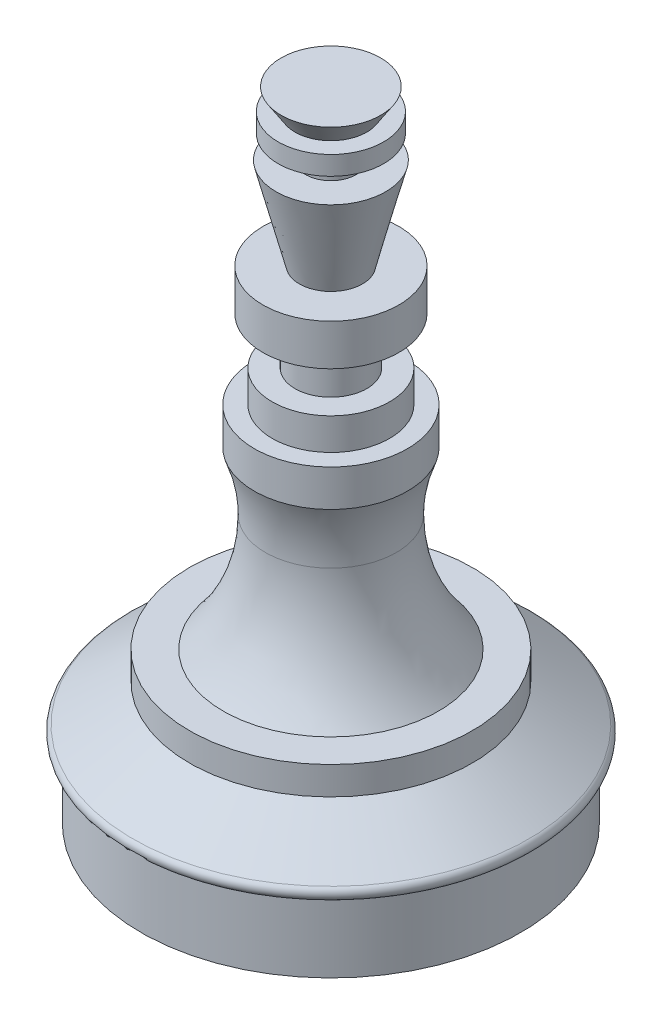
ISO-10303-21;
HEADER;
FILE_DESCRIPTION(('STEP AP214'),'2;1');
FILE_NAME('part.step','',(''),(''),'','','');
FILE_SCHEMA(('AUTOMOTIVE_DESIGN { 1 0 10303 214 1 1 1 1 }'));
ENDSEC;
DATA;
#1=APPLICATION_CONTEXT('core data for automotive mechanical design processes');
#2=APPLICATION_PROTOCOL_DEFINITION('international standard','automotive_design',2000,#1);
#3=PRODUCT_CONTEXT('',#1,'mechanical');
#4=PRODUCT('Part','Part','',(#3));
#5=PRODUCT_RELATED_PRODUCT_CATEGORY('part','',(#4));
#6=PRODUCT_DEFINITION_FORMATION('','',#4);
#7=PRODUCT_DEFINITION_CONTEXT('part definition',#1,'design');
#8=PRODUCT_DEFINITION('design','',#6,#7);
#9=PRODUCT_DEFINITION_SHAPE('','',#8);
#10=(LENGTH_UNIT() NAMED_UNIT(*) SI_UNIT(.MILLI.,.METRE.));
#11=(NAMED_UNIT(*) PLANE_ANGLE_UNIT() SI_UNIT($,.RADIAN.));
#12=(NAMED_UNIT(*) SI_UNIT($,.STERADIAN.) SOLID_ANGLE_UNIT());
#13=UNCERTAINTY_MEASURE_WITH_UNIT(LENGTH_MEASURE(1.E-05),#10,'distance_accuracy_value','');
#14=(GEOMETRIC_REPRESENTATION_CONTEXT(3) GLOBAL_UNCERTAINTY_ASSIGNED_CONTEXT((#13)) GLOBAL_UNIT_ASSIGNED_CONTEXT((#10,
#11,#12)) REPRESENTATION_CONTEXT('',''));
#15=CARTESIAN_POINT('',(0.,0.,0.));
#16=DIRECTION('',(0.,0.,1.));
#17=DIRECTION('',(1.,0.,0.));
#18=AXIS2_PLACEMENT_3D('',#15,#16,#17);
#19=CARTESIAN_POINT('',(53.1215863518585,630.394620324153,0.));
#20=DIRECTION('',(0.,-1.,0.));
#21=DIRECTION('',(1.,0.,0.));
#22=AXIS2_PLACEMENT_3D('',#19,#20,#21);
#23=PLANE('',#22);
#24=CARTESIAN_POINT('',(0.,630.394620324153,0.));
#25=DIRECTION('',(0.,1.,0.));
#26=DIRECTION('',(-1.,0.,0.));
#27=AXIS2_PLACEMENT_3D('',#24,#25,#26);
#28=CIRCLE('',#27,53.1215863518585);
#29=CARTESIAN_POINT('',(-53.1215863518585,630.394620324153,0.));
#30=VERTEX_POINT('',#29);
#31=EDGE_CURVE('E10',#30,#30,#28,.T.);
#32=ORIENTED_EDGE('',*,*,#31,.T.);
#33=EDGE_LOOP('',(#32));
#34=FACE_BOUND('',#33,.T.);
#35=ADVANCED_FACE('F33',(#34),#23,.F.);
#36=CARTESIAN_POINT('',(0.,607.429590651659,0.));
#37=DIRECTION('',(0.,1.,0.));
#38=DIRECTION('',(-1.,0.,0.));
#39=AXIS2_PLACEMENT_3D('',#36,#37,#38);
#40=CONICAL_SURFACE('',#39,38.3360857759204,0.57202325795027);
#41=ORIENTED_EDGE('',*,*,#31,.F.);
#42=EDGE_LOOP('',(#41));
#43=FACE_BOUND('',#42,.T.);
#44=CARTESIAN_POINT('',(0.,607.429590651659,0.));
#45=DIRECTION('',(0.,1.,0.));
#46=DIRECTION('',(-1.,0.,0.));
#47=AXIS2_PLACEMENT_3D('',#44,#45,#46);
#48=CIRCLE('',#47,38.3360857759204);
#49=CARTESIAN_POINT('',(-38.3360857759204,607.429590651659,0.));
#50=VERTEX_POINT('',#49);
#51=EDGE_CURVE('E39',#50,#50,#48,.T.);
#52=ORIENTED_EDGE('',*,*,#51,.T.);
#53=EDGE_LOOP('',(#52));
#54=FACE_BOUND('',#53,.T.);
#55=ADVANCED_FACE('F128',(#43,#54),#40,.T.);
#56=CARTESIAN_POINT('',(56.3366905060078,607.429590651659,0.));
#57=DIRECTION('',(0.,-1.,0.));
#58=DIRECTION('',(1.,0.,0.));
#59=AXIS2_PLACEMENT_3D('',#56,#57,#58);
#60=PLANE('',#59);
#61=ORIENTED_EDGE('',*,*,#51,.F.);
#62=EDGE_LOOP('',(#61));
#63=FACE_BOUND('',#62,.T.);
#64=CARTESIAN_POINT('',(0.,607.429590651659,0.));
#65=DIRECTION('',(0.,1.,0.));
#66=DIRECTION('',(-1.,0.,0.));
#67=AXIS2_PLACEMENT_3D('',#64,#65,#66);
#68=CIRCLE('',#67,56.3366905060078);
#69=CARTESIAN_POINT('',(-56.3366905060078,607.429590651659,0.));
#70=VERTEX_POINT('',#69);
#71=EDGE_CURVE('E43',#70,#70,#68,.T.);
#72=ORIENTED_EDGE('',*,*,#71,.T.);
#73=EDGE_LOOP('',(#72));
#74=FACE_BOUND('',#73,.T.);
#75=ADVANCED_FACE('F132',(#63,#74),#60,.F.);
#76=CARTESIAN_POINT('',(0.,630.394620324153,0.));
#77=DIRECTION('',(0.,1.,0.));
#78=DIRECTION('',(-1.,0.,0.));
#79=AXIS2_PLACEMENT_3D('',#76,#77,#78);
#80=CYLINDRICAL_SURFACE('',#79,56.3366905060078);
#81=ORIENTED_EDGE('',*,*,#71,.F.);
#82=EDGE_LOOP('',(#81));
#83=FACE_BOUND('',#82,.T.);
#84=CARTESIAN_POINT('',(0.,587.220364539864,0.));
#85=DIRECTION('',(0.,1.,0.));
#86=DIRECTION('',(-1.,0.,0.));
#87=AXIS2_PLACEMENT_3D('',#84,#85,#86);
#88=CIRCLE('',#87,56.3366905060078);
#89=CARTESIAN_POINT('',(-56.3366905060078,587.220364539864,0.));
#90=VERTEX_POINT('',#89);
#91=EDGE_CURVE('E47',#90,#90,#88,.T.);
#92=ORIENTED_EDGE('',*,*,#91,.T.);
#93=EDGE_LOOP('',(#92));
#94=FACE_BOUND('',#93,.T.);
#95=ADVANCED_FACE('F137',(#83,#94),#80,.T.);
#96=CARTESIAN_POINT('',(26.9414525252146,587.220364539864,0.));
#97=DIRECTION('',(0.,1.,0.));
#98=DIRECTION('',(-1.,0.,0.));
#99=AXIS2_PLACEMENT_3D('',#96,#97,#98);
#100=PLANE('',#99);
#101=ORIENTED_EDGE('',*,*,#91,.F.);
#102=EDGE_LOOP('',(#101));
#103=FACE_BOUND('',#102,.T.);
#104=CARTESIAN_POINT('',(0.,587.220364539864,0.));
#105=DIRECTION('',(0.,1.,0.));
#106=DIRECTION('',(-1.,0.,0.));
#107=AXIS2_PLACEMENT_3D('',#104,#105,#106);
#108=CIRCLE('',#107,26.9414525252146);
#109=CARTESIAN_POINT('',(-26.9414525252147,587.220364539864,0.));
#110=VERTEX_POINT('',#109);
#111=EDGE_CURVE('E52',#110,#110,#108,.T.);
#112=ORIENTED_EDGE('',*,*,#111,.T.);
#113=EDGE_LOOP('',(#112));
#114=FACE_BOUND('',#113,.T.);
#115=ADVANCED_FACE('F143',(#103,#114),#100,.F.);
#116=CARTESIAN_POINT('',(0.,630.394620324153,0.));
#117=DIRECTION('',(0.,1.,0.));
#118=DIRECTION('',(-1.,0.,0.));
#119=AXIS2_PLACEMENT_3D('',#116,#117,#118);
#120=CYLINDRICAL_SURFACE('',#119,26.9414525252146);
#121=ORIENTED_EDGE('',*,*,#111,.F.);
#122=EDGE_LOOP('',(#121));
#123=FACE_BOUND('',#122,.T.);
#124=CARTESIAN_POINT('',(0.,562.418132493569,0.));
#125=DIRECTION('',(0.,1.,0.));
#126=DIRECTION('',(-1.,0.,0.));
#127=AXIS2_PLACEMENT_3D('',#124,#125,#126);
#128=CIRCLE('',#127,26.9414525252146);
#129=CARTESIAN_POINT('',(-26.9414525252147,562.418132493569,0.));
#130=VERTEX_POINT('',#129);
#131=EDGE_CURVE('E55',#130,#130,#128,.T.);
#132=ORIENTED_EDGE('',*,*,#131,.T.);
#133=EDGE_LOOP('',(#132));
#134=FACE_BOUND('',#133,.T.);
#135=ADVANCED_FACE('F147',(#123,#134),#120,.T.);
#136=CARTESIAN_POINT('',(58.5109429159707,562.418132493569,0.));
#137=DIRECTION('',(0.,-1.,0.));
#138=DIRECTION('',(1.,0.,0.));
#139=AXIS2_PLACEMENT_3D('',#136,#137,#138);
#140=PLANE('',#139);
#141=ORIENTED_EDGE('',*,*,#131,.F.);
#142=EDGE_LOOP('',(#141));
#143=FACE_BOUND('',#142,.T.);
#144=CARTESIAN_POINT('',(0.,562.418132493569,0.));
#145=DIRECTION('',(0.,1.,0.));
#146=DIRECTION('',(-1.,0.,0.));
#147=AXIS2_PLACEMENT_3D('',#144,#145,#146);
#148=CIRCLE('',#147,58.5109429159707);
#149=CARTESIAN_POINT('',(-58.5109429159707,562.418132493569,0.));
#150=VERTEX_POINT('',#149);
#151=EDGE_CURVE('E58',#150,#150,#148,.T.);
#152=ORIENTED_EDGE('',*,*,#151,.T.);
#153=EDGE_LOOP('',(#152));
#154=FACE_BOUND('',#153,.T.);
#155=ADVANCED_FACE('F151',(#143,#154),#140,.F.);
#156=CARTESIAN_POINT('',(0.,464.803902593066,0.));
#157=DIRECTION('',(0.,1.,0.));
#158=DIRECTION('',(-1.,0.,0.));
#159=AXIS2_PLACEMENT_3D('',#156,#157,#158);
#160=CONICAL_SURFACE('',#159,33.7428236192114,0.248490593176229);
#161=ORIENTED_EDGE('',*,*,#151,.F.);
#162=EDGE_LOOP('',(#161));
#163=FACE_BOUND('',#162,.T.);
#164=CARTESIAN_POINT('',(0.,464.803902593066,0.));
#165=DIRECTION('',(0.,1.,0.));
#166=DIRECTION('',(-1.,0.,0.));
#167=AXIS2_PLACEMENT_3D('',#164,#165,#166);
#168=CIRCLE('',#167,33.7428236192114);
#169=CARTESIAN_POINT('',(-33.7428236192114,464.803902593066,0.));
#170=VERTEX_POINT('',#169);
#171=EDGE_CURVE('E61',#170,#170,#168,.T.);
#172=ORIENTED_EDGE('',*,*,#171,.T.);
#173=EDGE_LOOP('',(#172));
#174=FACE_BOUND('',#173,.T.);
#175=ADVANCED_FACE('F155',(#163,#174),#160,.T.);
#176=CARTESIAN_POINT('',(72.6181072671229,464.803902593066,0.));
#177=DIRECTION('',(0.,-1.,0.));
#178=DIRECTION('',(1.,0.,0.));
#179=AXIS2_PLACEMENT_3D('',#176,#177,#178);
#180=PLANE('',#179);
#181=ORIENTED_EDGE('',*,*,#171,.F.);
#182=EDGE_LOOP('',(#181));
#183=FACE_BOUND('',#182,.T.);
#184=CARTESIAN_POINT('',(0.,464.803902593066,0.));
#185=DIRECTION('',(0.,1.,0.));
#186=DIRECTION('',(-1.,0.,0.));
#187=AXIS2_PLACEMENT_3D('',#184,#185,#186);
#188=CIRCLE('',#187,72.6181072671229);
#189=CARTESIAN_POINT('',(-72.6181072671229,464.803902593066,0.));
#190=VERTEX_POINT('',#189);
#191=EDGE_CURVE('E64',#190,#190,#188,.T.);
#192=ORIENTED_EDGE('',*,*,#191,.T.);
#193=EDGE_LOOP('',(#192));
#194=FACE_BOUND('',#193,.T.);
#195=ADVANCED_FACE('F159',(#183,#194),#180,.F.);
#196=CARTESIAN_POINT('',(0.,630.394620324153,0.));
#197=DIRECTION('',(0.,1.,0.));
#198=DIRECTION('',(-1.,0.,0.));
#199=AXIS2_PLACEMENT_3D('',#196,#197,#198);
#200=CYLINDRICAL_SURFACE('',#199,72.6181072671229);
#201=ORIENTED_EDGE('',*,*,#191,.F.);
#202=EDGE_LOOP('',(#201));
#203=FACE_BOUND('',#202,.T.);
#204=CARTESIAN_POINT('',(0.,420.777560933067,0.));
#205=DIRECTION('',(0.,1.,0.));
#206=DIRECTION('',(-1.,0.,0.));
#207=AXIS2_PLACEMENT_3D('',#204,#205,#206);
#208=CIRCLE('',#207,72.6181072671229);
#209=CARTESIAN_POINT('',(-72.6181072671229,420.777560933067,0.));
#210=VERTEX_POINT('',#209);
#211=EDGE_CURVE('E67',#210,#210,#208,.T.);
#212=ORIENTED_EDGE('',*,*,#211,.T.);
#213=EDGE_LOOP('',(#212));
#214=FACE_BOUND('',#213,.T.);
#215=ADVANCED_FACE('F163',(#203,#214),#200,.T.);
#216=CARTESIAN_POINT('',(38.3360857759204,420.777560933067,0.));
#217=DIRECTION('',(0.,1.,0.));
#218=DIRECTION('',(-1.,0.,0.));
#219=AXIS2_PLACEMENT_3D('',#216,#217,#218);
#220=PLANE('',#219);
#221=ORIENTED_EDGE('',*,*,#211,.F.);
#222=EDGE_LOOP('',(#221));
#223=FACE_BOUND('',#222,.T.);
#224=CARTESIAN_POINT('',(0.,420.777560933067,0.));
#225=DIRECTION('',(0.,1.,0.));
#226=DIRECTION('',(-1.,0.,0.));
#227=AXIS2_PLACEMENT_3D('',#224,#225,#226);
#228=CIRCLE('',#227,38.3360857759204);
#229=CARTESIAN_POINT('',(-38.3360857759204,420.777560933067,0.));
#230=VERTEX_POINT('',#229);
#231=EDGE_CURVE('E70',#230,#230,#228,.T.);
#232=ORIENTED_EDGE('',*,*,#231,.T.);
#233=EDGE_LOOP('',(#232));
#234=FACE_BOUND('',#233,.T.);
#235=ADVANCED_FACE('F167',(#223,#234),#220,.F.);
#236=CARTESIAN_POINT('',(0.,630.394620324153,0.));
#237=DIRECTION('',(0.,1.,0.));
#238=DIRECTION('',(-1.,0.,0.));
#239=AXIS2_PLACEMENT_3D('',#236,#237,#238);
#240=CYLINDRICAL_SURFACE('',#239,38.3360857759204);
#241=ORIENTED_EDGE('',*,*,#231,.F.);
#242=EDGE_LOOP('',(#241));
#243=FACE_BOUND('',#242,.T.);
#244=CARTESIAN_POINT('',(0.,370.281465061129,0.));
#245=DIRECTION('',(0.,1.,0.));
#246=DIRECTION('',(-1.,0.,0.));
#247=AXIS2_PLACEMENT_3D('',#244,#245,#246);
#248=CIRCLE('',#247,38.3360857759204);
#249=CARTESIAN_POINT('',(-38.3360857759204,370.281465061129,0.));
#250=VERTEX_POINT('',#249);
#251=EDGE_CURVE('E73',#250,#250,#248,.T.);
#252=ORIENTED_EDGE('',*,*,#251,.T.);
#253=EDGE_LOOP('',(#252));
#254=FACE_BOUND('',#253,.T.);
#255=ADVANCED_FACE('F171',(#243,#254),#240,.T.);
#256=CARTESIAN_POINT('',(62.7052335829198,370.281465061129,0.));
#257=DIRECTION('',(0.,-1.,0.));
#258=DIRECTION('',(1.,0.,0.));
#259=AXIS2_PLACEMENT_3D('',#256,#257,#258);
#260=PLANE('',#259);
#261=ORIENTED_EDGE('',*,*,#251,.F.);
#262=EDGE_LOOP('',(#261));
#263=FACE_BOUND('',#262,.T.);
#264=CARTESIAN_POINT('',(0.,370.281465061129,0.));
#265=DIRECTION('',(0.,1.,0.));
#266=DIRECTION('',(-1.,0.,0.));
#267=AXIS2_PLACEMENT_3D('',#264,#265,#266);
#268=CIRCLE('',#267,62.7052335829197);
#269=CARTESIAN_POINT('',(-62.7052335829197,370.281465061129,0.));
#270=VERTEX_POINT('',#269);
#271=EDGE_CURVE('E76',#270,#270,#268,.T.);
#272=ORIENTED_EDGE('',*,*,#271,.T.);
#273=EDGE_LOOP('',(#272));
#274=FACE_BOUND('',#273,.T.);
#275=ADVANCED_FACE('F175',(#263,#274),#260,.F.);
#276=CARTESIAN_POINT('',(0.,630.394620324153,0.));
#277=DIRECTION('',(0.,1.,0.));
#278=DIRECTION('',(-1.,0.,0.));
#279=AXIS2_PLACEMENT_3D('',#276,#277,#278);
#280=CYLINDRICAL_SURFACE('',#279,62.7052335829197);
#281=ORIENTED_EDGE('',*,*,#271,.F.);
#282=EDGE_LOOP('',(#281));
#283=FACE_BOUND('',#282,.T.);
#284=CARTESIAN_POINT('',(0.,336.412479973435,0.));
#285=DIRECTION('',(0.,1.,0.));
#286=DIRECTION('',(-1.,0.,0.));
#287=AXIS2_PLACEMENT_3D('',#284,#285,#286);
#288=CIRCLE('',#287,62.7052335829197);
#289=CARTESIAN_POINT('',(-62.7052335829197,336.412479973435,0.));
#290=VERTEX_POINT('',#289);
#291=EDGE_CURVE('E79',#290,#290,#288,.T.);
#292=ORIENTED_EDGE('',*,*,#291,.T.);
#293=EDGE_LOOP('',(#292));
#294=FACE_BOUND('',#293,.T.);
#295=ADVANCED_FACE('F179',(#283,#294),#280,.T.);
#296=CARTESIAN_POINT('',(81.7196623417174,336.412479973435,0.));
#297=DIRECTION('',(0.,-1.,0.));
#298=DIRECTION('',(1.,0.,0.));
#299=AXIS2_PLACEMENT_3D('',#296,#297,#298);
#300=PLANE('',#299);
#301=ORIENTED_EDGE('',*,*,#291,.F.);
#302=EDGE_LOOP('',(#301));
#303=FACE_BOUND('',#302,.T.);
#304=CARTESIAN_POINT('',(0.,336.412479973435,0.));
#305=DIRECTION('',(0.,1.,0.));
#306=DIRECTION('',(-1.,0.,0.));
#307=AXIS2_PLACEMENT_3D('',#304,#305,#306);
#308=CIRCLE('',#307,81.7196623417174);
#309=CARTESIAN_POINT('',(-81.7196623417173,336.412479973435,0.));
#310=VERTEX_POINT('',#309);
#311=EDGE_CURVE('E82',#310,#310,#308,.T.);
#312=ORIENTED_EDGE('',*,*,#311,.T.);
#313=EDGE_LOOP('',(#312));
#314=FACE_BOUND('',#313,.T.);
#315=ADVANCED_FACE('F183',(#303,#314),#300,.F.);
#316=CARTESIAN_POINT('',(0.,630.394620324153,0.));
#317=DIRECTION('',(0.,1.,0.));
#318=DIRECTION('',(-1.,0.,0.));
#319=AXIS2_PLACEMENT_3D('',#316,#317,#318);
#320=CYLINDRICAL_SURFACE('',#319,81.7196623417174);
#321=ORIENTED_EDGE('',*,*,#311,.F.);
#322=EDGE_LOOP('',(#321));
#323=FACE_BOUND('',#322,.T.);
#324=CARTESIAN_POINT('',(0.,297.155069786218,0.));
#325=DIRECTION('',(0.,1.,0.));
#326=DIRECTION('',(-1.,0.,0.));
#327=AXIS2_PLACEMENT_3D('',#324,#325,#326);
#328=CIRCLE('',#327,81.7196623417175);
#329=CARTESIAN_POINT('',(-81.7196623417175,297.155069786218,0.));
#330=VERTEX_POINT('',#329);
#331=EDGE_CURVE('E85',#330,#330,#328,.T.);
#332=ORIENTED_EDGE('',*,*,#331,.T.);
#333=EDGE_LOOP('',(#332));
#334=FACE_BOUND('',#333,.T.);
#335=ADVANCED_FACE('F187',(#323,#334),#320,.T.);
#336=CARTESIAN_POINT('',(0.,234.724529371943,0.));
#337=DIRECTION('',(0.,1.,0.));
#338=DIRECTION('',(-1.,0.,0.));
#339=AXIS2_PLACEMENT_3D('',#336,#337,#338);
#340=TOROIDAL_SURFACE('',#339,241.927339452541,171.942060536869);
#341=ORIENTED_EDGE('',*,*,#331,.F.);
#342=EDGE_LOOP('',(#341));
#343=FACE_BOUND('',#342,.T.);
#344=CARTESIAN_POINT('',(0.,234.618307317881,0.));
#345=DIRECTION('',(0.,1.,0.));
#346=DIRECTION('',(-1.,0.,0.));
#347=AXIS2_PLACEMENT_3D('',#344,#345,#346);
#348=CIRCLE('',#347,69.9853117265089);
#349=CARTESIAN_POINT('',(-69.9853117265088,234.618307317881,0.));
#350=VERTEX_POINT('',#349);
#351=EDGE_CURVE('E88',#350,#350,#348,.T.);
#352=ORIENTED_EDGE('',*,*,#351,.T.);
#353=EDGE_LOOP('',(#352));
#354=FACE_BOUND('',#353,.T.);
#355=ADVANCED_FACE('F191',(#343,#354),#340,.F.);
#356=CARTESIAN_POINT('',(0.,234.738590306729,0.));
#357=DIRECTION('',(0.,1.,0.));
#358=DIRECTION('',(-1.,0.,0.));
#359=AXIS2_PLACEMENT_3D('',#356,#357,#358);
#360=TOROIDAL_SURFACE('',#359,264.687826059589,194.702551487187);
#361=ORIENTED_EDGE('',*,*,#351,.F.);
#362=EDGE_LOOP('',(#361));
#363=FACE_BOUND('',#362,.T.);
#364=CARTESIAN_POINT('',(0.,110.339389585202,0.));
#365=DIRECTION('',(0.,1.,0.));
#366=DIRECTION('',(-1.,0.,0.));
#367=AXIS2_PLACEMENT_3D('',#364,#365,#366);
#368=CIRCLE('',#367,114.908246625455);
#369=CARTESIAN_POINT('',(-114.908246625455,110.339389585202,0.));
#370=VERTEX_POINT('',#369);
#371=EDGE_CURVE('E91',#370,#370,#368,.T.);
#372=ORIENTED_EDGE('',*,*,#371,.T.);
#373=EDGE_LOOP('',(#372));
#374=FACE_BOUND('',#373,.T.);
#375=ADVANCED_FACE('F195',(#363,#374),#360,.F.);
#376=CARTESIAN_POINT('',(151.022762916765,110.339389585202,0.));
#377=DIRECTION('',(0.,-1.,0.));
#378=DIRECTION('',(1.,0.,0.));
#379=AXIS2_PLACEMENT_3D('',#376,#377,#378);
#380=PLANE('',#379);
#381=ORIENTED_EDGE('',*,*,#371,.F.);
#382=EDGE_LOOP('',(#381));
#383=FACE_BOUND('',#382,.T.);
#384=CARTESIAN_POINT('',(0.,110.339389585202,0.));
#385=DIRECTION('',(0.,1.,0.));
#386=DIRECTION('',(-1.,0.,0.));
#387=AXIS2_PLACEMENT_3D('',#384,#385,#386);
#388=CIRCLE('',#387,151.022762916765);
#389=CARTESIAN_POINT('',(-151.022762916765,110.339389585202,0.));
#390=VERTEX_POINT('',#389);
#391=EDGE_CURVE('E94',#390,#390,#388,.T.);
#392=ORIENTED_EDGE('',*,*,#391,.T.);
#393=EDGE_LOOP('',(#392));
#394=FACE_BOUND('',#393,.T.);
#395=ADVANCED_FACE('F199',(#383,#394),#380,.F.);
#396=CARTESIAN_POINT('',(0.,630.394620324153,0.));
#397=DIRECTION('',(0.,1.,0.));
#398=DIRECTION('',(-1.,0.,0.));
#399=AXIS2_PLACEMENT_3D('',#396,#397,#398);
#400=CYLINDRICAL_SURFACE('',#399,151.022762916765);
#401=ORIENTED_EDGE('',*,*,#391,.F.);
#402=EDGE_LOOP('',(#401));
#403=FACE_BOUND('',#402,.T.);
#404=CARTESIAN_POINT('',(0.,80.3907663192372,0.));
#405=DIRECTION('',(0.,1.,0.));
#406=DIRECTION('',(-1.,0.,0.));
#407=AXIS2_PLACEMENT_3D('',#404,#405,#406);
#408=CIRCLE('',#407,151.022762916765);
#409=CARTESIAN_POINT('',(-151.022762916765,80.3907663192372,0.));
#410=VERTEX_POINT('',#409);
#411=EDGE_CURVE('E97',#410,#410,#408,.T.);
#412=ORIENTED_EDGE('',*,*,#411,.T.);
#413=EDGE_LOOP('',(#412));
#414=FACE_BOUND('',#413,.T.);
#415=ADVANCED_FACE('F203',(#403,#414),#400,.T.);
#416=CARTESIAN_POINT('',(0.,40.410223182769,0.));
#417=DIRECTION('',(0.,-1.,0.));
#418=DIRECTION('',(1.,0.,0.));
#419=AXIS2_PLACEMENT_3D('',#416,#417,#418);
#420=CONICAL_SURFACE('',#419,211.321286991439,0.985306280774173);
#421=ORIENTED_EDGE('',*,*,#411,.F.);
#422=EDGE_LOOP('',(#421));
#423=FACE_BOUND('',#422,.T.);
#424=CARTESIAN_POINT('',(0.,40.410223182769,0.));
#425=DIRECTION('',(0.,1.,0.));
#426=DIRECTION('',(-1.,0.,0.));
#427=AXIS2_PLACEMENT_3D('',#424,#425,#426);
#428=CIRCLE('',#427,211.321286991439);
#429=CARTESIAN_POINT('',(-211.321286991439,40.410223182769,0.));
#430=VERTEX_POINT('',#429);
#431=EDGE_CURVE('E100',#430,#430,#428,.T.);
#432=ORIENTED_EDGE('',*,*,#431,.T.);
#433=EDGE_LOOP('',(#432));
#434=FACE_BOUND('',#433,.T.);
#435=ADVANCED_FACE('F207',(#423,#434),#420,.T.);
#436=CARTESIAN_POINT('',(0.,34.159412812654,0.));
#437=DIRECTION('',(0.,1.,0.));
#438=DIRECTION('',(-1.,0.,0.));
#439=AXIS2_PLACEMENT_3D('',#436,#437,#438);
#440=TOROIDAL_SURFACE('',#439,207.176727941689,7.5);
#441=ORIENTED_EDGE('',*,*,#431,.F.);
#442=EDGE_LOOP('',(#441));
#443=FACE_BOUND('',#442,.T.);
#444=CARTESIAN_POINT('',(0.,26.659412812654,0.));
#445=DIRECTION('',(0.,1.,0.));
#446=DIRECTION('',(-1.,0.,0.));
#447=AXIS2_PLACEMENT_3D('',#444,#445,#446);
#448=CIRCLE('',#447,207.176727941689);
#449=CARTESIAN_POINT('',(-207.176727941689,26.659412812654,0.));
#450=VERTEX_POINT('',#449);
#451=EDGE_CURVE('E103',#450,#450,#448,.T.);
#452=ORIENTED_EDGE('',*,*,#451,.T.);
#453=EDGE_LOOP('',(#452));
#454=FACE_BOUND('',#453,.T.);
#455=ADVANCED_FACE('F211',(#443,#454),#440,.T.);
#456=CARTESIAN_POINT('',(206.552197866157,26.659412812654,0.));
#457=DIRECTION('',(0.,1.,0.));
#458=DIRECTION('',(-1.,0.,0.));
#459=AXIS2_PLACEMENT_3D('',#456,#457,#458);
#460=PLANE('',#459);
#461=ORIENTED_EDGE('',*,*,#451,.F.);
#462=EDGE_LOOP('',(#461));
#463=FACE_BOUND('',#462,.T.);
#464=CARTESIAN_POINT('',(0.,26.659412812654,0.));
#465=DIRECTION('',(0.,1.,0.));
#466=DIRECTION('',(-1.,0.,0.));
#467=AXIS2_PLACEMENT_3D('',#464,#465,#466);
#468=CIRCLE('',#467,206.552197866157);
#469=CARTESIAN_POINT('',(-206.552197866157,26.659412812654,0.));
#470=VERTEX_POINT('',#469);
#471=EDGE_CURVE('E106',#470,#470,#468,.T.);
#472=ORIENTED_EDGE('',*,*,#471,.T.);
#473=EDGE_LOOP('',(#472));
#474=FACE_BOUND('',#473,.T.);
#475=ADVANCED_FACE('F215',(#463,#474),#460,.F.);
#476=CARTESIAN_POINT('',(0.,22.909412812654,0.));
#477=DIRECTION('',(0.,1.,0.));
#478=DIRECTION('',(-1.,0.,0.));
#479=AXIS2_PLACEMENT_3D('',#476,#477,#478);
#480=TOROIDAL_SURFACE('',#479,206.552197866157,3.75);
#481=ORIENTED_EDGE('',*,*,#471,.F.);
#482=EDGE_LOOP('',(#481));
#483=FACE_BOUND('',#482,.T.);
#484=CARTESIAN_POINT('',(0.,22.909412812654,0.));
#485=DIRECTION('',(0.,1.,0.));
#486=DIRECTION('',(-1.,0.,0.));
#487=AXIS2_PLACEMENT_3D('',#484,#485,#486);
#488=CIRCLE('',#487,202.802197866157);
#489=CARTESIAN_POINT('',(-202.802197866157,22.909412812654,0.));
#490=VERTEX_POINT('',#489);
#491=EDGE_CURVE('E109',#490,#490,#488,.T.);
#492=ORIENTED_EDGE('',*,*,#491,.T.);
#493=EDGE_LOOP('',(#492));
#494=FACE_BOUND('',#493,.T.);
#495=ADVANCED_FACE('F124',(#483,#494),#480,.F.);
#496=CARTESIAN_POINT('',(0.,630.394620324153,0.));
#497=DIRECTION('',(0.,1.,0.));
#498=DIRECTION('',(-1.,0.,0.));
#499=AXIS2_PLACEMENT_3D('',#496,#497,#498);
#500=CYLINDRICAL_SURFACE('',#499,202.802197866157);
#501=ORIENTED_EDGE('',*,*,#491,.F.);
#502=EDGE_LOOP('',(#501));
#503=FACE_BOUND('',#502,.T.);
#504=CARTESIAN_POINT('',(0.,-50.3602926449378,0.));
#505=DIRECTION('',(0.,1.,0.));
#506=DIRECTION('',(-1.,0.,0.));
#507=AXIS2_PLACEMENT_3D('',#504,#505,#506);
#508=CIRCLE('',#507,202.802197866157);
#509=CARTESIAN_POINT('',(-202.802197866157,-50.3602926449378,0.));
#510=VERTEX_POINT('',#509);
#511=EDGE_CURVE('E112',#510,#510,#508,.T.);
#512=ORIENTED_EDGE('',*,*,#511,.T.);
#513=EDGE_LOOP('',(#512));
#514=FACE_BOUND('',#513,.T.);
#515=ADVANCED_FACE('F116',(#503,#514),#500,.T.);
#516=CARTESIAN_POINT('',(0.,-50.3602926449378,0.));
#517=DIRECTION('',(0.,1.,0.));
#518=DIRECTION('',(-1.,0.,0.));
#519=AXIS2_PLACEMENT_3D('',#516,#517,#518);
#520=PLANE('',#519);
#521=ORIENTED_EDGE('',*,*,#511,.F.);
#522=EDGE_LOOP('',(#521));
#523=FACE_BOUND('',#522,.T.);
#524=ADVANCED_FACE('F118',(#523),#520,.F.);
#525=CLOSED_SHELL('',(#35,#55,#75,#95,#115,#135,#155,#175,#195,#215,#235,#255,#275,#295,#315,
#335,#355,#375,#395,#415,#435,#455,#475,#495,#515,#524));
#526=MANIFOLD_SOLID_BREP('B2',#525);
#527=ADVANCED_BREP_SHAPE_REPRESENTATION('',(#18,#526),#14);
#528=SHAPE_DEFINITION_REPRESENTATION(#9,#527);
ENDSEC;
END-ISO-10303-21;
